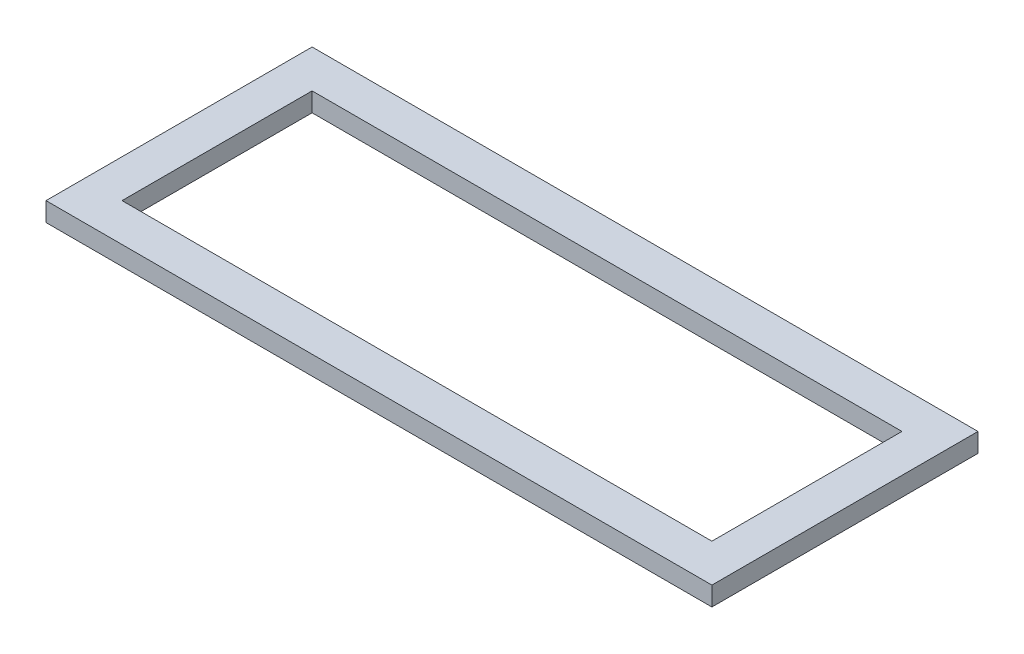
ISO-10303-21;
HEADER;
FILE_DESCRIPTION(('STEP AP214'),'2;1');
FILE_NAME('part.step','',(''),(''),'','','');
FILE_SCHEMA(('AUTOMOTIVE_DESIGN { 1 0 10303 214 1 1 1 1 }'));
ENDSEC;
DATA;
#1=APPLICATION_CONTEXT('core data for automotive mechanical design processes');
#2=APPLICATION_PROTOCOL_DEFINITION('international standard','automotive_design',2000,#1);
#3=PRODUCT_CONTEXT('',#1,'mechanical');
#4=PRODUCT('Part','Part','',(#3));
#5=PRODUCT_RELATED_PRODUCT_CATEGORY('part','',(#4));
#6=PRODUCT_DEFINITION_FORMATION('','',#4);
#7=PRODUCT_DEFINITION_CONTEXT('part definition',#1,'design');
#8=PRODUCT_DEFINITION('design','',#6,#7);
#9=PRODUCT_DEFINITION_SHAPE('','',#8);
#10=(LENGTH_UNIT() NAMED_UNIT(*) SI_UNIT(.MILLI.,.METRE.));
#11=(NAMED_UNIT(*) PLANE_ANGLE_UNIT() SI_UNIT($,.RADIAN.));
#12=(NAMED_UNIT(*) SI_UNIT($,.STERADIAN.) SOLID_ANGLE_UNIT());
#13=UNCERTAINTY_MEASURE_WITH_UNIT(LENGTH_MEASURE(1.E-05),#10,'distance_accuracy_value','');
#14=(GEOMETRIC_REPRESENTATION_CONTEXT(3) GLOBAL_UNCERTAINTY_ASSIGNED_CONTEXT((#13)) GLOBAL_UNIT_ASSIGNED_CONTEXT((#10,
#11,#12)) REPRESENTATION_CONTEXT('',''));
#15=CARTESIAN_POINT('',(0.,0.,0.));
#16=DIRECTION('',(0.,0.,1.));
#17=DIRECTION('',(1.,0.,0.));
#18=AXIS2_PLACEMENT_3D('',#15,#16,#17);
#19=CARTESIAN_POINT('',(0.,14.5,0.));
#20=DIRECTION('',(0.,-1.,0.));
#21=DIRECTION('',(0.,0.,-1.));
#22=AXIS2_PLACEMENT_3D('',#19,#20,#21);
#23=PLANE('',#22);
#24=DIRECTION('',(0.,0.,-1.));
#25=VECTOR('',#24,1.);
#26=CARTESIAN_POINT('',(0.,14.5,0.));
#27=LINE('',#26,#25);
#28=CARTESIAN_POINT('',(0.,14.5,203.));
#29=VERTEX_POINT('',#28);
#30=CARTESIAN_POINT('',(0.,14.5,0.));
#31=VERTEX_POINT('',#30);
#32=EDGE_CURVE('E137',#29,#31,#27,.T.);
#33=ORIENTED_EDGE('',*,*,#32,.T.);
#34=DIRECTION('',(-1.,0.,0.));
#35=VECTOR('',#34,1.);
#36=CARTESIAN_POINT('',(0.,14.5,0.));
#37=LINE('',#36,#35);
#38=CARTESIAN_POINT('',(-508.,14.5,0.));
#39=VERTEX_POINT('',#38);
#40=EDGE_CURVE('E140',#31,#39,#37,.T.);
#41=ORIENTED_EDGE('',*,*,#40,.T.);
#42=DIRECTION('',(0.,0.,1.));
#43=VECTOR('',#42,1.);
#44=CARTESIAN_POINT('',(-508.,14.5,0.));
#45=LINE('',#44,#43);
#46=CARTESIAN_POINT('',(-508.,14.5,203.));
#47=VERTEX_POINT('',#46);
#48=EDGE_CURVE('E143',#39,#47,#45,.T.);
#49=ORIENTED_EDGE('',*,*,#48,.T.);
#50=DIRECTION('',(1.,0.,0.));
#51=VECTOR('',#50,1.);
#52=CARTESIAN_POINT('',(0.,14.5,203.));
#53=LINE('',#52,#51);
#54=EDGE_CURVE('E145',#47,#29,#53,.T.);
#55=ORIENTED_EDGE('',*,*,#54,.T.);
#56=EDGE_LOOP('',(#33,#41,#49,#55));
#57=FACE_BOUND('',#56,.T.);
#58=DIRECTION('',(0.,0.,-1.));
#59=VECTOR('',#58,1.);
#60=CARTESIAN_POINT('',(-29.,14.5,29.));
#61=LINE('',#60,#59);
#62=CARTESIAN_POINT('',(-29.,14.5,174.));
#63=VERTEX_POINT('',#62);
#64=CARTESIAN_POINT('',(-29.,14.5,29.));
#65=VERTEX_POINT('',#64);
#66=EDGE_CURVE('E101',#63,#65,#61,.T.);
#67=ORIENTED_EDGE('',*,*,#66,.F.);
#68=DIRECTION('',(1.,0.,0.));
#69=VECTOR('',#68,1.);
#70=CARTESIAN_POINT('',(-29.,14.5,174.));
#71=LINE('',#70,#69);
#72=CARTESIAN_POINT('',(-479.,14.5,174.));
#73=VERTEX_POINT('',#72);
#74=EDGE_CURVE('E123',#73,#63,#71,.T.);
#75=ORIENTED_EDGE('',*,*,#74,.F.);
#76=DIRECTION('',(0.,0.,1.));
#77=VECTOR('',#76,1.);
#78=CARTESIAN_POINT('',(-479.,14.5,29.0000000000001));
#79=LINE('',#78,#77);
#80=CARTESIAN_POINT('',(-479.,14.5,29.0000000000001));
#81=VERTEX_POINT('',#80);
#82=EDGE_CURVE('E121',#81,#73,#79,.T.);
#83=ORIENTED_EDGE('',*,*,#82,.F.);
#84=DIRECTION('',(-1.,0.,0.));
#85=VECTOR('',#84,1.);
#86=CARTESIAN_POINT('',(-29.,14.5,29.));
#87=LINE('',#86,#85);
#88=EDGE_CURVE('E109',#65,#81,#87,.T.);
#89=ORIENTED_EDGE('',*,*,#88,.F.);
#90=EDGE_LOOP('',(#67,#75,#83,#89));
#91=FACE_BOUND('',#90,.T.);
#92=ADVANCED_FACE('F36',(#57,#91),#23,.F.);
#93=CARTESIAN_POINT('',(0.,0.,0.));
#94=DIRECTION('',(0.,-1.,0.));
#95=DIRECTION('',(0.,0.,-1.));
#96=AXIS2_PLACEMENT_3D('',#93,#94,#95);
#97=PLANE('',#96);
#98=DIRECTION('',(0.,0.,-1.));
#99=VECTOR('',#98,1.);
#100=CARTESIAN_POINT('',(0.,0.,0.));
#101=LINE('',#100,#99);
#102=CARTESIAN_POINT('',(0.,0.,203.));
#103=VERTEX_POINT('',#102);
#104=CARTESIAN_POINT('',(0.,0.,0.));
#105=VERTEX_POINT('',#104);
#106=EDGE_CURVE('E117',#103,#105,#101,.T.);
#107=ORIENTED_EDGE('',*,*,#106,.F.);
#108=DIRECTION('',(1.,0.,0.));
#109=VECTOR('',#108,1.);
#110=CARTESIAN_POINT('',(0.,0.,203.));
#111=LINE('',#110,#109);
#112=CARTESIAN_POINT('',(-508.,0.,203.));
#113=VERTEX_POINT('',#112);
#114=EDGE_CURVE('E141',#113,#103,#111,.T.);
#115=ORIENTED_EDGE('',*,*,#114,.F.);
#116=DIRECTION('',(0.,0.,1.));
#117=VECTOR('',#116,1.);
#118=CARTESIAN_POINT('',(-508.,0.,0.));
#119=LINE('',#118,#117);
#120=CARTESIAN_POINT('',(-508.,0.,0.));
#121=VERTEX_POINT('',#120);
#122=EDGE_CURVE('E152',#121,#113,#119,.T.);
#123=ORIENTED_EDGE('',*,*,#122,.F.);
#124=DIRECTION('',(-1.,0.,0.));
#125=VECTOR('',#124,1.);
#126=CARTESIAN_POINT('',(0.,0.,0.));
#127=LINE('',#126,#125);
#128=EDGE_CURVE('E150',#105,#121,#127,.T.);
#129=ORIENTED_EDGE('',*,*,#128,.F.);
#130=EDGE_LOOP('',(#107,#115,#123,#129));
#131=FACE_BOUND('',#130,.T.);
#132=DIRECTION('',(1.,0.,0.));
#133=VECTOR('',#132,1.);
#134=CARTESIAN_POINT('',(-29.,0.,174.));
#135=LINE('',#134,#133);
#136=CARTESIAN_POINT('',(-479.,0.,174.));
#137=VERTEX_POINT('',#136);
#138=CARTESIAN_POINT('',(-29.,0.,174.));
#139=VERTEX_POINT('',#138);
#140=EDGE_CURVE('E110',#137,#139,#135,.T.);
#141=ORIENTED_EDGE('',*,*,#140,.T.);
#142=DIRECTION('',(0.,0.,-1.));
#143=VECTOR('',#142,1.);
#144=CARTESIAN_POINT('',(-29.,0.,29.));
#145=LINE('',#144,#143);
#146=CARTESIAN_POINT('',(-29.,0.,29.));
#147=VERTEX_POINT('',#146);
#148=EDGE_CURVE('E59',#139,#147,#145,.T.);
#149=ORIENTED_EDGE('',*,*,#148,.T.);
#150=DIRECTION('',(-1.,0.,0.));
#151=VECTOR('',#150,1.);
#152=CARTESIAN_POINT('',(-29.,0.,29.));
#153=LINE('',#152,#151);
#154=CARTESIAN_POINT('',(-479.,0.,29.0000000000001));
#155=VERTEX_POINT('',#154);
#156=EDGE_CURVE('E116',#147,#155,#153,.T.);
#157=ORIENTED_EDGE('',*,*,#156,.T.);
#158=DIRECTION('',(0.,0.,1.));
#159=VECTOR('',#158,1.);
#160=CARTESIAN_POINT('',(-479.,0.,29.0000000000001));
#161=LINE('',#160,#159);
#162=EDGE_CURVE('E129',#155,#137,#161,.T.);
#163=ORIENTED_EDGE('',*,*,#162,.T.);
#164=EDGE_LOOP('',(#141,#149,#157,#163));
#165=FACE_BOUND('',#164,.T.);
#166=ADVANCED_FACE('F170',(#131,#165),#97,.T.);
#167=CARTESIAN_POINT('',(0.,14.5,0.));
#168=DIRECTION('',(-1.,0.,0.));
#169=DIRECTION('',(0.,0.,1.));
#170=AXIS2_PLACEMENT_3D('',#167,#168,#169);
#171=PLANE('',#170);
#172=ORIENTED_EDGE('',*,*,#106,.T.);
#173=DIRECTION('',(0.,-1.,0.));
#174=VECTOR('',#173,1.);
#175=CARTESIAN_POINT('',(0.,14.5,0.));
#176=LINE('',#175,#174);
#177=EDGE_CURVE('E11',#31,#105,#176,.T.);
#178=ORIENTED_EDGE('',*,*,#177,.F.);
#179=ORIENTED_EDGE('',*,*,#32,.F.);
#180=DIRECTION('',(0.,-1.,0.));
#181=VECTOR('',#180,1.);
#182=CARTESIAN_POINT('',(0.,14.5,203.));
#183=LINE('',#182,#181);
#184=EDGE_CURVE('E147',#29,#103,#183,.T.);
#185=ORIENTED_EDGE('',*,*,#184,.T.);
#186=EDGE_LOOP('',(#172,#178,#179,#185));
#187=FACE_BOUND('',#186,.T.);
#188=ADVANCED_FACE('F38',(#187),#171,.F.);
#189=CARTESIAN_POINT('',(0.,14.5,0.));
#190=DIRECTION('',(0.,0.,1.));
#191=DIRECTION('',(1.,0.,0.));
#192=AXIS2_PLACEMENT_3D('',#189,#190,#191);
#193=PLANE('',#192);
#194=ORIENTED_EDGE('',*,*,#128,.T.);
#195=DIRECTION('',(0.,-1.,0.));
#196=VECTOR('',#195,1.);
#197=CARTESIAN_POINT('',(-508.,14.5,0.));
#198=LINE('',#197,#196);
#199=EDGE_CURVE('E44',#39,#121,#198,.T.);
#200=ORIENTED_EDGE('',*,*,#199,.F.);
#201=ORIENTED_EDGE('',*,*,#40,.F.);
#202=ORIENTED_EDGE('',*,*,#177,.T.);
#203=EDGE_LOOP('',(#194,#200,#201,#202));
#204=FACE_BOUND('',#203,.T.);
#205=ADVANCED_FACE('F180',(#204),#193,.F.);
#206=CARTESIAN_POINT('',(-508.,14.5,0.));
#207=DIRECTION('',(1.,0.,0.));
#208=DIRECTION('',(0.,0.,-1.));
#209=AXIS2_PLACEMENT_3D('',#206,#207,#208);
#210=PLANE('',#209);
#211=ORIENTED_EDGE('',*,*,#122,.T.);
#212=DIRECTION('',(0.,-1.,0.));
#213=VECTOR('',#212,1.);
#214=CARTESIAN_POINT('',(-508.,14.5,203.));
#215=LINE('',#214,#213);
#216=EDGE_CURVE('E157',#47,#113,#215,.T.);
#217=ORIENTED_EDGE('',*,*,#216,.F.);
#218=ORIENTED_EDGE('',*,*,#48,.F.);
#219=ORIENTED_EDGE('',*,*,#199,.T.);
#220=EDGE_LOOP('',(#211,#217,#218,#219));
#221=FACE_BOUND('',#220,.T.);
#222=ADVANCED_FACE('F164',(#221),#210,.F.);
#223=CARTESIAN_POINT('',(0.,14.5,203.));
#224=DIRECTION('',(0.,0.,-1.));
#225=DIRECTION('',(-1.,0.,0.));
#226=AXIS2_PLACEMENT_3D('',#223,#224,#225);
#227=PLANE('',#226);
#228=ORIENTED_EDGE('',*,*,#114,.T.);
#229=ORIENTED_EDGE('',*,*,#184,.F.);
#230=ORIENTED_EDGE('',*,*,#54,.F.);
#231=ORIENTED_EDGE('',*,*,#216,.T.);
#232=EDGE_LOOP('',(#228,#229,#230,#231));
#233=FACE_BOUND('',#232,.T.);
#234=ADVANCED_FACE('F174',(#233),#227,.F.);
#235=CARTESIAN_POINT('',(-29.,14.5,29.));
#236=DIRECTION('',(-1.,0.,0.));
#237=DIRECTION('',(0.,0.,1.));
#238=AXIS2_PLACEMENT_3D('',#235,#236,#237);
#239=PLANE('',#238);
#240=ORIENTED_EDGE('',*,*,#148,.F.);
#241=DIRECTION('',(0.,-1.,0.));
#242=VECTOR('',#241,1.);
#243=CARTESIAN_POINT('',(-29.,14.5,174.));
#244=LINE('',#243,#242);
#245=EDGE_CURVE('E105',#63,#139,#244,.T.);
#246=ORIENTED_EDGE('',*,*,#245,.F.);
#247=ORIENTED_EDGE('',*,*,#66,.T.);
#248=DIRECTION('',(0.,-1.,0.));
#249=VECTOR('',#248,1.);
#250=CARTESIAN_POINT('',(-29.,14.5,29.));
#251=LINE('',#250,#249);
#252=EDGE_CURVE('E104',#65,#147,#251,.T.);
#253=ORIENTED_EDGE('',*,*,#252,.T.);
#254=EDGE_LOOP('',(#240,#246,#247,#253));
#255=FACE_BOUND('',#254,.T.);
#256=ADVANCED_FACE('F103',(#255),#239,.T.);
#257=CARTESIAN_POINT('',(-29.,14.5,29.));
#258=DIRECTION('',(0.,0.,1.));
#259=DIRECTION('',(1.,0.,0.));
#260=AXIS2_PLACEMENT_3D('',#257,#258,#259);
#261=PLANE('',#260);
#262=ORIENTED_EDGE('',*,*,#156,.F.);
#263=ORIENTED_EDGE('',*,*,#252,.F.);
#264=ORIENTED_EDGE('',*,*,#88,.T.);
#265=DIRECTION('',(0.,-1.,0.));
#266=VECTOR('',#265,1.);
#267=CARTESIAN_POINT('',(-479.,14.5,29.0000000000001));
#268=LINE('',#267,#266);
#269=EDGE_CURVE('E118',#81,#155,#268,.T.);
#270=ORIENTED_EDGE('',*,*,#269,.T.);
#271=EDGE_LOOP('',(#262,#263,#264,#270));
#272=FACE_BOUND('',#271,.T.);
#273=ADVANCED_FACE('F113',(#272),#261,.T.);
#274=CARTESIAN_POINT('',(-479.,14.5,29.0000000000001));
#275=DIRECTION('',(1.,0.,0.));
#276=DIRECTION('',(0.,0.,-1.));
#277=AXIS2_PLACEMENT_3D('',#274,#275,#276);
#278=PLANE('',#277);
#279=ORIENTED_EDGE('',*,*,#162,.F.);
#280=ORIENTED_EDGE('',*,*,#269,.F.);
#281=ORIENTED_EDGE('',*,*,#82,.T.);
#282=DIRECTION('',(0.,-1.,0.));
#283=VECTOR('',#282,1.);
#284=CARTESIAN_POINT('',(-479.,14.5,174.));
#285=LINE('',#284,#283);
#286=EDGE_CURVE('E51',#73,#137,#285,.T.);
#287=ORIENTED_EDGE('',*,*,#286,.T.);
#288=EDGE_LOOP('',(#279,#280,#281,#287));
#289=FACE_BOUND('',#288,.T.);
#290=ADVANCED_FACE('F203',(#289),#278,.T.);
#291=CARTESIAN_POINT('',(-29.,14.5,174.));
#292=DIRECTION('',(0.,0.,-1.));
#293=DIRECTION('',(-1.,0.,0.));
#294=AXIS2_PLACEMENT_3D('',#291,#292,#293);
#295=PLANE('',#294);
#296=ORIENTED_EDGE('',*,*,#140,.F.);
#297=ORIENTED_EDGE('',*,*,#286,.F.);
#298=ORIENTED_EDGE('',*,*,#74,.T.);
#299=ORIENTED_EDGE('',*,*,#245,.T.);
#300=EDGE_LOOP('',(#296,#297,#298,#299));
#301=FACE_BOUND('',#300,.T.);
#302=ADVANCED_FACE('F207',(#301),#295,.T.);
#303=CLOSED_SHELL('',(#92,#166,#188,#205,#222,#234,#256,#273,#290,#302));
#304=MANIFOLD_SOLID_BREP('B2',#303);
#305=ADVANCED_BREP_SHAPE_REPRESENTATION('',(#18,#304),#14);
#306=SHAPE_DEFINITION_REPRESENTATION(#9,#305);
ENDSEC;
END-ISO-10303-21;
